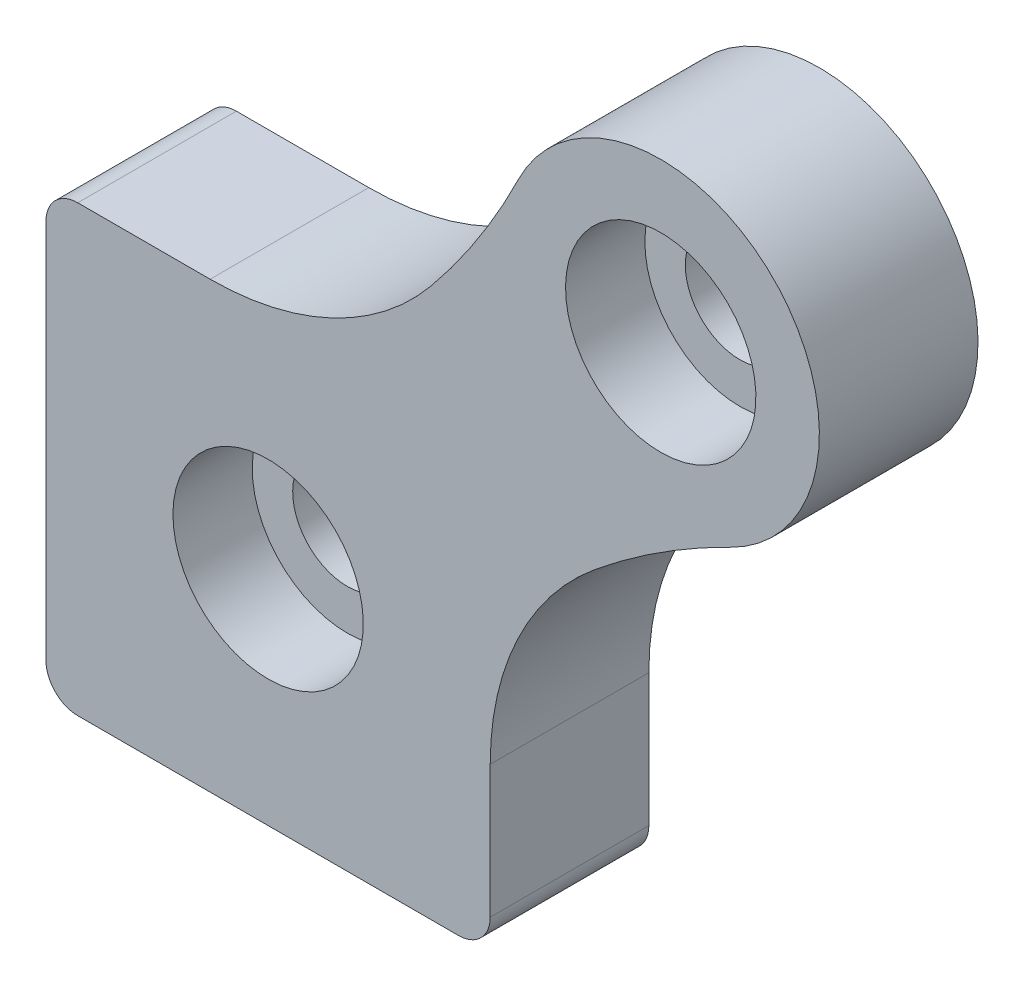
ISO-10303-21;
HEADER;
FILE_DESCRIPTION(('STEP AP214'),'2;1');
FILE_NAME('part.step','',(''),(''),'','','');
FILE_SCHEMA(('AUTOMOTIVE_DESIGN { 1 0 10303 214 1 1 1 1 }'));
ENDSEC;
DATA;
#1=APPLICATION_CONTEXT('core data for automotive mechanical design processes');
#2=APPLICATION_PROTOCOL_DEFINITION('international standard','automotive_design',2000,#1);
#3=PRODUCT_CONTEXT('',#1,'mechanical');
#4=PRODUCT('Part','Part','',(#3));
#5=PRODUCT_RELATED_PRODUCT_CATEGORY('part','',(#4));
#6=PRODUCT_DEFINITION_FORMATION('','',#4);
#7=PRODUCT_DEFINITION_CONTEXT('part definition',#1,'design');
#8=PRODUCT_DEFINITION('design','',#6,#7);
#9=PRODUCT_DEFINITION_SHAPE('','',#8);
#10=(LENGTH_UNIT() NAMED_UNIT(*) SI_UNIT(.MILLI.,.METRE.));
#11=(NAMED_UNIT(*) PLANE_ANGLE_UNIT() SI_UNIT($,.RADIAN.));
#12=(NAMED_UNIT(*) SI_UNIT($,.STERADIAN.) SOLID_ANGLE_UNIT());
#13=UNCERTAINTY_MEASURE_WITH_UNIT(LENGTH_MEASURE(1.E-05),#10,'distance_accuracy_value','');
#14=(GEOMETRIC_REPRESENTATION_CONTEXT(3) GLOBAL_UNCERTAINTY_ASSIGNED_CONTEXT((#13)) GLOBAL_UNIT_ASSIGNED_CONTEXT((#10,
#11,#12)) REPRESENTATION_CONTEXT('',''));
#15=CARTESIAN_POINT('',(0.,0.,0.));
#16=DIRECTION('',(0.,0.,1.));
#17=DIRECTION('',(1.,0.,0.));
#18=AXIS2_PLACEMENT_3D('',#15,#16,#17);
#19=CARTESIAN_POINT('',(-98.3023344038562,333.34350910381,241.099998474121));
#20=DIRECTION('',(0.,0.,1.));
#21=DIRECTION('',(0.707106781186548,0.707106781186547,0.));
#22=AXIS2_PLACEMENT_3D('',#19,#20,#21);
#23=CYLINDRICAL_SURFACE('',#22,1.725);
#24=CARTESIAN_POINT('',(-98.3023344038562,333.34350910381,247.600009918213));
#25=DIRECTION('',(0.,0.,1.));
#26=DIRECTION('',(0.707106781186548,0.707106781186547,0.));
#27=AXIS2_PLACEMENT_3D('',#24,#25,#26);
#28=CIRCLE('',#27,1.725);
#29=CARTESIAN_POINT('',(-97.0825752063094,334.563268301357,247.600009918213));
#30=VERTEX_POINT('',#29);
#31=EDGE_CURVE('E141',#30,#30,#28,.T.);
#32=ORIENTED_EDGE('',*,*,#31,.F.);
#33=EDGE_LOOP('',(#32));
#34=FACE_BOUND('',#33,.T.);
#35=CARTESIAN_POINT('',(-98.3023344038562,333.34350910381,250.100021362305));
#36=DIRECTION('',(0.,0.,1.));
#37=DIRECTION('',(0.707106781186548,0.707106781186547,0.));
#38=AXIS2_PLACEMENT_3D('',#35,#36,#37);
#39=CIRCLE('',#38,1.725);
#40=CARTESIAN_POINT('',(-97.0825752063094,334.563268301357,250.100021362305));
#41=VERTEX_POINT('',#40);
#42=EDGE_CURVE('E10',#41,#41,#39,.T.);
#43=ORIENTED_EDGE('',*,*,#42,.T.);
#44=EDGE_LOOP('',(#43));
#45=FACE_BOUND('',#44,.T.);
#46=ADVANCED_FACE('F15',(#34,#45),#23,.F.);
#47=CARTESIAN_POINT('',(-98.3023344038562,333.34350910381,260.100021362305));
#48=DIRECTION('',(0.,0.,1.));
#49=DIRECTION('',(0.707106781186548,0.707106781186547,0.));
#50=AXIS2_PLACEMENT_3D('',#47,#48,#49);
#51=CYLINDRICAL_SURFACE('',#50,3.);
#52=CARTESIAN_POINT('',(-98.3023344038562,333.34350910381,252.599987030029));
#53=DIRECTION('',(0.,0.,-1.));
#54=DIRECTION('',(0.707106781186548,0.707106781186547,0.));
#55=AXIS2_PLACEMENT_3D('',#52,#53,#54);
#56=CIRCLE('',#55,3.);
#57=CARTESIAN_POINT('',(-96.1810140602965,335.46482944737,252.599987030029));
#58=VERTEX_POINT('',#57);
#59=EDGE_CURVE('E123',#58,#58,#56,.T.);
#60=ORIENTED_EDGE('',*,*,#59,.F.);
#61=EDGE_LOOP('',(#60));
#62=FACE_BOUND('',#61,.T.);
#63=CARTESIAN_POINT('',(-98.3023344038562,333.34350910381,250.100021362305));
#64=DIRECTION('',(0.,0.,-1.));
#65=DIRECTION('',(0.707106781186548,0.707106781186547,0.));
#66=AXIS2_PLACEMENT_3D('',#63,#64,#65);
#67=CIRCLE('',#66,3.);
#68=CARTESIAN_POINT('',(-96.1810140602965,335.46482944737,250.100021362305));
#69=VERTEX_POINT('',#68);
#70=EDGE_CURVE('E25',#69,#69,#67,.T.);
#71=ORIENTED_EDGE('',*,*,#70,.T.);
#72=EDGE_LOOP('',(#71));
#73=FACE_BOUND('',#72,.T.);
#74=ADVANCED_FACE('F276',(#62,#73),#51,.F.);
#75=CARTESIAN_POINT('',(-98.3023344038562,333.34350910381,250.100021362305));
#76=DIRECTION('',(0.,0.,-1.));
#77=DIRECTION('',(-0.707106781186548,-0.707106781186547,0.));
#78=AXIS2_PLACEMENT_3D('',#75,#76,#77);
#79=PLANE('',#78);
#80=ORIENTED_EDGE('',*,*,#42,.F.);
#81=EDGE_LOOP('',(#80));
#82=FACE_BOUND('',#81,.T.);
#83=ORIENTED_EDGE('',*,*,#70,.F.);
#84=EDGE_LOOP('',(#83));
#85=FACE_BOUND('',#84,.T.);
#86=ADVANCED_FACE('F282',(#82,#85),#79,.F.);
#87=CARTESIAN_POINT('',(-110.676703074621,320.969140433045,250.100021362305));
#88=DIRECTION('',(0.,0.,-1.));
#89=DIRECTION('',(-0.707106781186548,-0.707106781186547,0.));
#90=AXIS2_PLACEMENT_3D('',#87,#88,#89);
#91=PLANE('',#90);
#92=CARTESIAN_POINT('',(-110.676703074621,320.969140433045,250.100021362305));
#93=DIRECTION('',(0.,0.,-1.));
#94=DIRECTION('',(0.707106781186548,0.707106781186547,0.));
#95=AXIS2_PLACEMENT_3D('',#92,#93,#94);
#96=CIRCLE('',#95,3.);
#97=CARTESIAN_POINT('',(-108.555382731061,323.090460776605,250.100021362305));
#98=VERTEX_POINT('',#97);
#99=EDGE_CURVE('E138',#98,#98,#96,.T.);
#100=ORIENTED_EDGE('',*,*,#99,.F.);
#101=EDGE_LOOP('',(#100));
#102=FACE_BOUND('',#101,.T.);
#103=CARTESIAN_POINT('',(-110.676703074621,320.969140433045,250.100021362305));
#104=DIRECTION('',(0.,0.,-1.));
#105=DIRECTION('',(0.707106781186548,0.707106781186547,0.));
#106=AXIS2_PLACEMENT_3D('',#103,#104,#105);
#107=CIRCLE('',#106,1.725);
#108=CARTESIAN_POINT('',(-109.456943877074,322.188899630592,250.100021362305));
#109=VERTEX_POINT('',#108);
#110=EDGE_CURVE('E137',#109,#109,#107,.T.);
#111=ORIENTED_EDGE('',*,*,#110,.T.);
#112=EDGE_LOOP('',(#111));
#113=FACE_BOUND('',#112,.T.);
#114=ADVANCED_FACE('F290',(#102,#113),#91,.F.);
#115=CARTESIAN_POINT('',(-110.676703074621,320.969140433045,260.100021362305));
#116=DIRECTION('',(0.,0.,1.));
#117=DIRECTION('',(0.707106781186548,0.707106781186547,0.));
#118=AXIS2_PLACEMENT_3D('',#115,#116,#117);
#119=CYLINDRICAL_SURFACE('',#118,3.);
#120=CARTESIAN_POINT('',(-110.676703074621,320.969140433045,252.599987030029));
#121=DIRECTION('',(0.,0.,-1.));
#122=DIRECTION('',(0.707106781186548,0.707106781186547,0.));
#123=AXIS2_PLACEMENT_3D('',#120,#121,#122);
#124=CIRCLE('',#123,3.);
#125=CARTESIAN_POINT('',(-108.555382731061,323.090460776605,252.599987030029));
#126=VERTEX_POINT('',#125);
#127=EDGE_CURVE('E126',#126,#126,#124,.T.);
#128=ORIENTED_EDGE('',*,*,#127,.F.);
#129=EDGE_LOOP('',(#128));
#130=FACE_BOUND('',#129,.T.);
#131=ORIENTED_EDGE('',*,*,#99,.T.);
#132=EDGE_LOOP('',(#131));
#133=FACE_BOUND('',#132,.T.);
#134=ADVANCED_FACE('F270',(#130,#133),#119,.F.);
#135=CARTESIAN_POINT('',(-110.676703074621,320.969140433045,241.099998474121));
#136=DIRECTION('',(0.,0.,1.));
#137=DIRECTION('',(0.707106781186548,0.707106781186547,0.));
#138=AXIS2_PLACEMENT_3D('',#135,#136,#137);
#139=CYLINDRICAL_SURFACE('',#138,1.725);
#140=CARTESIAN_POINT('',(-110.676703074621,320.969140433045,247.600009918213));
#141=DIRECTION('',(0.,0.,1.));
#142=DIRECTION('',(0.707106781186548,0.707106781186547,0.));
#143=AXIS2_PLACEMENT_3D('',#140,#141,#142);
#144=CIRCLE('',#143,1.725);
#145=CARTESIAN_POINT('',(-109.456943877074,322.188899630592,247.600009918213));
#146=VERTEX_POINT('',#145);
#147=EDGE_CURVE('E144',#146,#146,#144,.T.);
#148=ORIENTED_EDGE('',*,*,#147,.F.);
#149=EDGE_LOOP('',(#148));
#150=FACE_BOUND('',#149,.T.);
#151=ORIENTED_EDGE('',*,*,#110,.F.);
#152=EDGE_LOOP('',(#151));
#153=FACE_BOUND('',#152,.T.);
#154=ADVANCED_FACE('F261',(#150,#153),#139,.F.);
#155=CARTESIAN_POINT('',(-105.340154084218,326.981171906911,247.600009918213));
#156=DIRECTION('',(0.,0.,1.));
#157=DIRECTION('',(0.707106781186548,0.707106781186547,0.));
#158=AXIS2_PLACEMENT_3D('',#155,#156,#157);
#159=PLANE('',#158);
#160=ORIENTED_EDGE('',*,*,#31,.T.);
#161=EDGE_LOOP('',(#160));
#162=FACE_BOUND('',#161,.T.);
#163=ORIENTED_EDGE('',*,*,#147,.T.);
#164=EDGE_LOOP('',(#163));
#165=FACE_BOUND('',#164,.T.);
#166=CARTESIAN_POINT('',(-94.6767030746208,319.14262186003,247.600009918213));
#167=DIRECTION('',(0.,0.,-1.));
#168=DIRECTION('',(-0.904023296282805,0.427483192392369,0.));
#169=AXIS2_PLACEMENT_3D('',#166,#167,#168);
#170=CIRCLE('',#169,9.);
#171=CARTESIAN_POINT('',(-103.676703074621,319.14262186003,247.600009918213));
#172=VERTEX_POINT('',#171);
#173=CARTESIAN_POINT('',(-100.387349238617,326.098807624487,247.600009918213));
#174=VERTEX_POINT('',#173);
#175=EDGE_CURVE('E34',#172,#174,#170,.T.);
#176=ORIENTED_EDGE('',*,*,#175,.F.);
#177=DIRECTION('',(0.,1.,0.));
#178=VECTOR('',#177,1.);
#179=CARTESIAN_POINT('',(-103.676703074621,323.975156169978,247.600009918213));
#180=LINE('',#179,#178);
#181=CARTESIAN_POINT('',(-103.676703074621,314.969140433046,247.600009918213));
#182=VERTEX_POINT('',#181);
#183=EDGE_CURVE('E151',#182,#172,#180,.T.);
#184=ORIENTED_EDGE('',*,*,#183,.F.);
#185=CARTESIAN_POINT('',(-104.676703074621,314.969140433046,247.600009918213));
#186=DIRECTION('',(0.,0.,1.));
#187=DIRECTION('',(0.707106781186547,-0.707106781186548,0.));
#188=AXIS2_PLACEMENT_3D('',#185,#186,#187);
#189=CIRCLE('',#188,1.);
#190=CARTESIAN_POINT('',(-104.676703074621,313.969140433045,247.600009918213));
#191=VERTEX_POINT('',#190);
#192=EDGE_CURVE('E154',#191,#182,#189,.T.);
#193=ORIENTED_EDGE('',*,*,#192,.F.);
#194=DIRECTION('',(1.,0.,0.));
#195=VECTOR('',#194,1.);
#196=CARTESIAN_POINT('',(-108.008428579419,313.969140433046,247.600009918213));
#197=LINE('',#196,#195);
#198=CARTESIAN_POINT('',(-116.676703074621,313.969140433045,247.600009918213));
#199=VERTEX_POINT('',#198);
#200=EDGE_CURVE('E157',#199,#191,#197,.T.);
#201=ORIENTED_EDGE('',*,*,#200,.F.);
#202=CARTESIAN_POINT('',(-116.676703074621,314.969140433046,247.600009918213));
#203=DIRECTION('',(0.,0.,1.));
#204=DIRECTION('',(-0.707106781186548,-0.707106781186547,0.));
#205=AXIS2_PLACEMENT_3D('',#202,#203,#204);
#206=CIRCLE('',#205,1.);
#207=CARTESIAN_POINT('',(-117.676703074621,314.969140433046,247.600009918213));
#208=VERTEX_POINT('',#207);
#209=EDGE_CURVE('E162',#208,#199,#206,.T.);
#210=ORIENTED_EDGE('',*,*,#209,.F.);
#211=DIRECTION('',(0.,-1.,0.));
#212=VECTOR('',#211,1.);
#213=CARTESIAN_POINT('',(-117.676703074621,323.975156169978,247.600009918213));
#214=LINE('',#213,#212);
#215=CARTESIAN_POINT('',(-117.676703074621,326.969140433045,247.600009918213));
#216=VERTEX_POINT('',#215);
#217=EDGE_CURVE('E165',#216,#208,#214,.T.);
#218=ORIENTED_EDGE('',*,*,#217,.F.);
#219=CARTESIAN_POINT('',(-116.676703074621,326.969140433045,247.600009918213));
#220=DIRECTION('',(0.,0.,1.));
#221=DIRECTION('',(-0.707106781186547,0.707106781186548,0.));
#222=AXIS2_PLACEMENT_3D('',#219,#220,#221);
#223=CIRCLE('',#222,1.);
#224=CARTESIAN_POINT('',(-116.676703074621,327.969140433045,247.600009918213));
#225=VERTEX_POINT('',#224);
#226=EDGE_CURVE('E147',#225,#216,#223,.T.);
#227=ORIENTED_EDGE('',*,*,#226,.F.);
#228=DIRECTION('',(-1.,0.,0.));
#229=VECTOR('',#228,1.);
#230=CARTESIAN_POINT('',(-108.008428579419,327.969140433045,247.600009918213));
#231=LINE('',#230,#229);
#232=CARTESIAN_POINT('',(-112.503221647636,327.969140433045,247.600009918213));
#233=VERTEX_POINT('',#232);
#234=EDGE_CURVE('E149',#233,#225,#231,.T.);
#235=ORIENTED_EDGE('',*,*,#234,.F.);
#236=CARTESIAN_POINT('',(-112.503221647636,336.969140433045,247.600009918213));
#237=DIRECTION('',(0.,0.,-1.));
#238=DIRECTION('',(0.427483192392361,-0.904023296282809,0.));
#239=AXIS2_PLACEMENT_3D('',#236,#237,#238);
#240=CIRCLE('',#239,9.);
#241=CARTESIAN_POINT('',(-105.547035883179,331.258494269049,247.600009918213));
#242=VERTEX_POINT('',#241);
#243=EDGE_CURVE('E174',#242,#233,#240,.T.);
#244=ORIENTED_EDGE('',*,*,#243,.F.);
#245=CARTESIAN_POINT('',(-122.551045529629,345.217851558818,247.600009918213));
#246=DIRECTION('',(0.,0.,-1.));
#247=DIRECTION('',(-0.898100412065667,0.439790461296603,0.));
#248=AXIS2_PLACEMENT_3D('',#245,#246,#247);
#249=CIRCLE('',#248,21.9999999999999);
#250=CARTESIAN_POINT('',(-102.792836464185,335.542461410293,247.600009918213));
#251=VERTEX_POINT('',#250);
#252=EDGE_CURVE('E118',#251,#242,#249,.T.);
#253=ORIENTED_EDGE('',*,*,#252,.F.);
#254=CARTESIAN_POINT('',(-98.3023344038563,333.34350910381,247.600009918213));
#255=DIRECTION('',(0.,0.,1.));
#256=DIRECTION('',(0.707106781186548,0.707106781186547,0.));
#257=AXIS2_PLACEMENT_3D('',#254,#255,#256);
#258=CIRCLE('',#257,4.99999999999997);
#259=CARTESIAN_POINT('',(-96.1033820973733,328.853007043482,247.600009918213));
#260=VERTEX_POINT('',#259);
#261=EDGE_CURVE('E111',#260,#251,#258,.T.);
#262=ORIENTED_EDGE('',*,*,#261,.F.);
#263=CARTESIAN_POINT('',(-86.4279919488479,309.094797978037,247.600009918213));
#264=DIRECTION('',(0.,0.,-1.));
#265=DIRECTION('',(0.43979046129661,-0.898100412065664,0.));
#266=AXIS2_PLACEMENT_3D('',#263,#264,#265);
#267=CIRCLE('',#266,22.);
#268=EDGE_CURVE('E179',#174,#260,#267,.T.);
#269=ORIENTED_EDGE('',*,*,#268,.F.);
#270=EDGE_LOOP('',(#176,#184,#193,#201,#210,#218,#227,#235,#244,#253,#262,#269));
#271=FACE_BOUND('',#270,.T.);
#272=ADVANCED_FACE('F259',(#162,#165,#271),#159,.F.);
#273=CARTESIAN_POINT('',(-116.676703074621,326.969140433045,259.100028991699));
#274=DIRECTION('',(0.,0.,-1.));
#275=DIRECTION('',(-0.707106781186547,0.707106781186548,0.));
#276=AXIS2_PLACEMENT_3D('',#273,#274,#275);
#277=CYLINDRICAL_SURFACE('',#276,1.);
#278=ORIENTED_EDGE('',*,*,#226,.T.);
#279=DIRECTION('',(0.,0.,1.));
#280=VECTOR('',#279,1.);
#281=CARTESIAN_POINT('',(-117.676703074621,326.969140433045,259.100028991699));
#282=LINE('',#281,#280);
#283=CARTESIAN_POINT('',(-117.676703074621,326.969140433045,252.599990844727));
#284=VERTEX_POINT('',#283);
#285=EDGE_CURVE('E172',#216,#284,#282,.T.);
#286=ORIENTED_EDGE('',*,*,#285,.T.);
#287=CARTESIAN_POINT('',(-116.676703074621,326.969140433045,252.599987030029));
#288=DIRECTION('',(0.,0.,-1.));
#289=DIRECTION('',(-0.707106781186547,0.707106781186548,0.));
#290=AXIS2_PLACEMENT_3D('',#287,#288,#289);
#291=CIRCLE('',#290,1.);
#292=CARTESIAN_POINT('',(-116.676703074621,327.969140433045,252.599990844727));
#293=VERTEX_POINT('',#292);
#294=EDGE_CURVE('E185',#284,#293,#291,.T.);
#295=ORIENTED_EDGE('',*,*,#294,.T.);
#296=DIRECTION('',(0.,0.,-1.));
#297=VECTOR('',#296,1.);
#298=CARTESIAN_POINT('',(-116.676703074621,327.969140433045,259.100028991699));
#299=LINE('',#298,#297);
#300=EDGE_CURVE('E169',#293,#225,#299,.T.);
#301=ORIENTED_EDGE('',*,*,#300,.T.);
#302=EDGE_LOOP('',(#278,#286,#295,#301));
#303=FACE_BOUND('',#302,.T.);
#304=ADVANCED_FACE('F234',(#303),#277,.T.);
#305=CARTESIAN_POINT('',(-117.676703074621,320.969140433045,259.100028991699));
#306=DIRECTION('',(1.,0.,0.));
#307=DIRECTION('',(0.,0.,-1.));
#308=AXIS2_PLACEMENT_3D('',#305,#306,#307);
#309=PLANE('',#308);
#310=ORIENTED_EDGE('',*,*,#217,.T.);
#311=DIRECTION('',(0.,0.,-1.));
#312=VECTOR('',#311,1.);
#313=CARTESIAN_POINT('',(-117.676703074621,314.969140433046,259.100028991699));
#314=LINE('',#313,#312);
#315=CARTESIAN_POINT('',(-117.676703074621,314.969140433046,252.599990844727));
#316=VERTEX_POINT('',#315);
#317=EDGE_CURVE('E161',#316,#208,#314,.T.);
#318=ORIENTED_EDGE('',*,*,#317,.F.);
#319=DIRECTION('',(0.,-1.,0.));
#320=VECTOR('',#319,1.);
#321=CARTESIAN_POINT('',(-117.676703074621,320.969140433045,252.599990844727));
#322=LINE('',#321,#320);
#323=EDGE_CURVE('E193',#284,#316,#322,.T.);
#324=ORIENTED_EDGE('',*,*,#323,.F.);
#325=ORIENTED_EDGE('',*,*,#285,.F.);
#326=EDGE_LOOP('',(#310,#318,#324,#325));
#327=FACE_BOUND('',#326,.T.);
#328=ADVANCED_FACE('F239',(#327),#309,.F.);
#329=CARTESIAN_POINT('',(-116.676703074621,314.969140433046,259.100028991699));
#330=DIRECTION('',(0.,0.,-1.));
#331=DIRECTION('',(-0.707106781186548,-0.707106781186547,0.));
#332=AXIS2_PLACEMENT_3D('',#329,#330,#331);
#333=CYLINDRICAL_SURFACE('',#332,1.);
#334=ORIENTED_EDGE('',*,*,#209,.T.);
#335=DIRECTION('',(0.,0.,1.));
#336=VECTOR('',#335,1.);
#337=CARTESIAN_POINT('',(-116.676703074621,313.969140433045,259.100028991699));
#338=LINE('',#337,#336);
#339=CARTESIAN_POINT('',(-116.676703074621,313.969140433045,252.599990844727));
#340=VERTEX_POINT('',#339);
#341=EDGE_CURVE('E166',#199,#340,#338,.T.);
#342=ORIENTED_EDGE('',*,*,#341,.T.);
#343=CARTESIAN_POINT('',(-116.676703074621,314.969140433046,252.599987030029));
#344=DIRECTION('',(0.,0.,-1.));
#345=DIRECTION('',(-0.707106781186548,-0.707106781186547,0.));
#346=AXIS2_PLACEMENT_3D('',#343,#344,#345);
#347=CIRCLE('',#346,1.);
#348=EDGE_CURVE('E192',#340,#316,#347,.T.);
#349=ORIENTED_EDGE('',*,*,#348,.T.);
#350=ORIENTED_EDGE('',*,*,#317,.T.);
#351=EDGE_LOOP('',(#334,#342,#349,#350));
#352=FACE_BOUND('',#351,.T.);
#353=ADVANCED_FACE('F244',(#352),#333,.T.);
#354=CARTESIAN_POINT('',(-110.676703074621,313.969140433045,259.100028991699));
#355=DIRECTION('',(0.,1.,0.));
#356=DIRECTION('',(0.,0.,1.));
#357=AXIS2_PLACEMENT_3D('',#354,#355,#356);
#358=PLANE('',#357);
#359=ORIENTED_EDGE('',*,*,#200,.T.);
#360=DIRECTION('',(0.,0.,-1.));
#361=VECTOR('',#360,1.);
#362=CARTESIAN_POINT('',(-104.676703074621,313.969140433045,259.100028991699));
#363=LINE('',#362,#361);
#364=CARTESIAN_POINT('',(-104.676703074621,313.969140433045,252.599990844727));
#365=VERTEX_POINT('',#364);
#366=EDGE_CURVE('E153',#365,#191,#363,.T.);
#367=ORIENTED_EDGE('',*,*,#366,.F.);
#368=DIRECTION('',(1.,0.,0.));
#369=VECTOR('',#368,1.);
#370=CARTESIAN_POINT('',(-110.676703074621,313.969140433045,252.599990844727));
#371=LINE('',#370,#369);
#372=EDGE_CURVE('E196',#340,#365,#371,.T.);
#373=ORIENTED_EDGE('',*,*,#372,.F.);
#374=ORIENTED_EDGE('',*,*,#341,.F.);
#375=EDGE_LOOP('',(#359,#367,#373,#374));
#376=FACE_BOUND('',#375,.T.);
#377=ADVANCED_FACE('F246',(#376),#358,.F.);
#378=CARTESIAN_POINT('',(-104.676703074621,314.969140433046,259.100028991699));
#379=DIRECTION('',(0.,0.,-1.));
#380=DIRECTION('',(0.707106781186547,-0.707106781186548,0.));
#381=AXIS2_PLACEMENT_3D('',#378,#379,#380);
#382=CYLINDRICAL_SURFACE('',#381,1.);
#383=ORIENTED_EDGE('',*,*,#192,.T.);
#384=DIRECTION('',(0.,0.,1.));
#385=VECTOR('',#384,1.);
#386=CARTESIAN_POINT('',(-103.676703074621,314.969140433046,259.100028991699));
#387=LINE('',#386,#385);
#388=CARTESIAN_POINT('',(-103.676703074621,314.969140433046,252.599990844727));
#389=VERTEX_POINT('',#388);
#390=EDGE_CURVE('E158',#182,#389,#387,.T.);
#391=ORIENTED_EDGE('',*,*,#390,.T.);
#392=CARTESIAN_POINT('',(-104.676703074621,314.969140433046,252.599987030029));
#393=DIRECTION('',(0.,0.,-1.));
#394=DIRECTION('',(0.707106781186547,-0.707106781186548,0.));
#395=AXIS2_PLACEMENT_3D('',#392,#393,#394);
#396=CIRCLE('',#395,1.);
#397=EDGE_CURVE('E203',#389,#365,#396,.T.);
#398=ORIENTED_EDGE('',*,*,#397,.T.);
#399=ORIENTED_EDGE('',*,*,#366,.T.);
#400=EDGE_LOOP('',(#383,#391,#398,#399));
#401=FACE_BOUND('',#400,.T.);
#402=ADVANCED_FACE('F248',(#401),#382,.T.);
#403=CARTESIAN_POINT('',(-103.676703074621,320.969140433046,259.100028991699));
#404=DIRECTION('',(-1.,0.,0.));
#405=DIRECTION('',(0.,0.,1.));
#406=AXIS2_PLACEMENT_3D('',#403,#404,#405);
#407=PLANE('',#406);
#408=ORIENTED_EDGE('',*,*,#183,.T.);
#409=DIRECTION('',(0.,0.,-1.));
#410=VECTOR('',#409,1.);
#411=CARTESIAN_POINT('',(-103.676703074621,319.14262186003,241.599998474121));
#412=LINE('',#411,#410);
#413=CARTESIAN_POINT('',(-103.676703074621,319.14262186003,252.599990844727));
#414=VERTEX_POINT('',#413);
#415=EDGE_CURVE('E182',#414,#172,#412,.T.);
#416=ORIENTED_EDGE('',*,*,#415,.F.);
#417=DIRECTION('',(0.,1.,0.));
#418=VECTOR('',#417,1.);
#419=CARTESIAN_POINT('',(-103.676703074621,320.969140433046,252.599990844727));
#420=LINE('',#419,#418);
#421=EDGE_CURVE('E131',#389,#414,#420,.T.);
#422=ORIENTED_EDGE('',*,*,#421,.F.);
#423=ORIENTED_EDGE('',*,*,#390,.F.);
#424=EDGE_LOOP('',(#408,#416,#422,#423));
#425=FACE_BOUND('',#424,.T.);
#426=ADVANCED_FACE('F253',(#425),#407,.F.);
#427=CARTESIAN_POINT('',(-110.676703074621,327.969140433045,259.100028991699));
#428=DIRECTION('',(0.,-1.,0.));
#429=DIRECTION('',(0.,0.,-1.));
#430=AXIS2_PLACEMENT_3D('',#427,#428,#429);
#431=PLANE('',#430);
#432=ORIENTED_EDGE('',*,*,#234,.T.);
#433=ORIENTED_EDGE('',*,*,#300,.F.);
#434=DIRECTION('',(-1.,0.,0.));
#435=VECTOR('',#434,1.);
#436=CARTESIAN_POINT('',(-110.676703074621,327.969140433045,252.599990844727));
#437=LINE('',#436,#435);
#438=CARTESIAN_POINT('',(-112.503221647636,327.969140433045,252.599990844727));
#439=VERTEX_POINT('',#438);
#440=EDGE_CURVE('E195',#439,#293,#437,.T.);
#441=ORIENTED_EDGE('',*,*,#440,.F.);
#442=DIRECTION('',(0.,0.,1.));
#443=VECTOR('',#442,1.);
#444=CARTESIAN_POINT('',(-112.503221647636,327.969140433045,241.599998474121));
#445=LINE('',#444,#443);
#446=EDGE_CURVE('E177',#233,#439,#445,.T.);
#447=ORIENTED_EDGE('',*,*,#446,.F.);
#448=EDGE_LOOP('',(#432,#433,#441,#447));
#449=FACE_BOUND('',#448,.T.);
#450=ADVANCED_FACE('F231',(#449),#431,.F.);
#451=CARTESIAN_POINT('',(-94.6767030746208,319.14262186003,241.599998474121));
#452=DIRECTION('',(0.,0.,-1.));
#453=DIRECTION('',(-0.904023296282805,0.427483192392369,0.));
#454=AXIS2_PLACEMENT_3D('',#451,#452,#453);
#455=CYLINDRICAL_SURFACE('',#454,9.);
#456=ORIENTED_EDGE('',*,*,#175,.T.);
#457=DIRECTION('',(0.,0.,1.));
#458=VECTOR('',#457,1.);
#459=CARTESIAN_POINT('',(-100.387349238617,326.098807624487,241.599998474121));
#460=LINE('',#459,#458);
#461=CARTESIAN_POINT('',(-100.387349238617,326.098807624487,252.599987030029));
#462=VERTEX_POINT('',#461);
#463=EDGE_CURVE('E150',#174,#462,#460,.T.);
#464=ORIENTED_EDGE('',*,*,#463,.T.);
#465=CARTESIAN_POINT('',(-94.6767030746208,319.14262186003,252.599987030029));
#466=DIRECTION('',(0.,0.,1.));
#467=DIRECTION('',(-0.904023296282805,0.427483192392369,0.));
#468=AXIS2_PLACEMENT_3D('',#465,#466,#467);
#469=CIRCLE('',#468,9.);
#470=EDGE_CURVE('E211',#462,#414,#469,.T.);
#471=ORIENTED_EDGE('',*,*,#470,.T.);
#472=ORIENTED_EDGE('',*,*,#415,.T.);
#473=EDGE_LOOP('',(#456,#464,#471,#472));
#474=FACE_BOUND('',#473,.T.);
#475=ADVANCED_FACE('F255',(#474),#455,.F.);
#476=CARTESIAN_POINT('',(-86.4279919488479,309.094797978037,241.599998474121));
#477=DIRECTION('',(0.,0.,1.));
#478=DIRECTION('',(0.43979046129661,-0.898100412065664,0.));
#479=AXIS2_PLACEMENT_3D('',#476,#477,#478);
#480=CYLINDRICAL_SURFACE('',#479,22.);
#481=ORIENTED_EDGE('',*,*,#268,.T.);
#482=DIRECTION('',(0.,0.,1.));
#483=VECTOR('',#482,1.);
#484=CARTESIAN_POINT('',(-96.1033820973733,328.853007043482,241.599998474121));
#485=LINE('',#484,#483);
#486=CARTESIAN_POINT('',(-96.1033820973733,328.853007043482,252.599987030029));
#487=VERTEX_POINT('',#486);
#488=EDGE_CURVE('E176',#260,#487,#485,.T.);
#489=ORIENTED_EDGE('',*,*,#488,.T.);
#490=CARTESIAN_POINT('',(-86.4279919488479,309.094797978037,252.599987030029));
#491=DIRECTION('',(0.,0.,-1.));
#492=DIRECTION('',(0.43979046129661,-0.898100412065664,0.));
#493=AXIS2_PLACEMENT_3D('',#490,#491,#492);
#494=CIRCLE('',#493,22.);
#495=EDGE_CURVE('E121',#462,#487,#494,.T.);
#496=ORIENTED_EDGE('',*,*,#495,.F.);
#497=ORIENTED_EDGE('',*,*,#463,.F.);
#498=EDGE_LOOP('',(#481,#489,#496,#497));
#499=FACE_BOUND('',#498,.T.);
#500=ADVANCED_FACE('F258',(#499),#480,.F.);
#501=CARTESIAN_POINT('',(-112.503221647636,336.969140433045,241.599998474121));
#502=DIRECTION('',(0.,0.,1.));
#503=DIRECTION('',(0.427483192392361,-0.904023296282809,0.));
#504=AXIS2_PLACEMENT_3D('',#501,#502,#503);
#505=CYLINDRICAL_SURFACE('',#504,9.);
#506=ORIENTED_EDGE('',*,*,#243,.T.);
#507=ORIENTED_EDGE('',*,*,#446,.T.);
#508=CARTESIAN_POINT('',(-112.503221647636,336.969140433045,252.599987030029));
#509=DIRECTION('',(0.,0.,1.));
#510=DIRECTION('',(0.427483192392361,-0.904023296282809,0.));
#511=AXIS2_PLACEMENT_3D('',#508,#509,#510);
#512=CIRCLE('',#511,9.);
#513=CARTESIAN_POINT('',(-105.547035883179,331.258494269049,252.599987030029));
#514=VERTEX_POINT('',#513);
#515=EDGE_CURVE('E217',#439,#514,#512,.T.);
#516=ORIENTED_EDGE('',*,*,#515,.T.);
#517=DIRECTION('',(0.,0.,-1.));
#518=VECTOR('',#517,1.);
#519=CARTESIAN_POINT('',(-105.547035883179,331.258494269049,241.599998474121));
#520=LINE('',#519,#518);
#521=EDGE_CURVE('E101',#514,#242,#520,.T.);
#522=ORIENTED_EDGE('',*,*,#521,.T.);
#523=EDGE_LOOP('',(#506,#507,#516,#522));
#524=FACE_BOUND('',#523,.T.);
#525=ADVANCED_FACE('F226',(#524),#505,.F.);
#526=CARTESIAN_POINT('',(-122.551045529629,345.217851558818,241.599998474121));
#527=DIRECTION('',(0.,0.,-1.));
#528=DIRECTION('',(-0.898100412065667,0.439790461296603,0.));
#529=AXIS2_PLACEMENT_3D('',#526,#527,#528);
#530=CYLINDRICAL_SURFACE('',#529,21.9999999999999);
#531=ORIENTED_EDGE('',*,*,#252,.T.);
#532=ORIENTED_EDGE('',*,*,#521,.F.);
#533=CARTESIAN_POINT('',(-122.551045529629,345.217851558818,252.599987030029));
#534=DIRECTION('',(0.,0.,1.));
#535=DIRECTION('',(-0.898100412065667,0.439790461296603,0.));
#536=AXIS2_PLACEMENT_3D('',#533,#534,#535);
#537=CIRCLE('',#536,21.9999999999999);
#538=CARTESIAN_POINT('',(-102.792836464185,335.542461410293,252.599987030029));
#539=VERTEX_POINT('',#538);
#540=EDGE_CURVE('E113',#514,#539,#537,.T.);
#541=ORIENTED_EDGE('',*,*,#540,.T.);
#542=DIRECTION('',(0.,0.,-1.));
#543=VECTOR('',#542,1.);
#544=CARTESIAN_POINT('',(-102.792836464185,335.542461410293,241.599998474121));
#545=LINE('',#544,#543);
#546=EDGE_CURVE('E107',#539,#251,#545,.T.);
#547=ORIENTED_EDGE('',*,*,#546,.T.);
#548=EDGE_LOOP('',(#531,#532,#541,#547));
#549=FACE_BOUND('',#548,.T.);
#550=ADVANCED_FACE('F115',(#549),#530,.F.);
#551=CARTESIAN_POINT('',(-98.3023344038563,333.34350910381,241.599998474121));
#552=DIRECTION('',(0.,0.,-1.));
#553=DIRECTION('',(0.707106781186548,0.707106781186547,0.));
#554=AXIS2_PLACEMENT_3D('',#551,#552,#553);
#555=CYLINDRICAL_SURFACE('',#554,4.99999999999997);
#556=ORIENTED_EDGE('',*,*,#261,.T.);
#557=ORIENTED_EDGE('',*,*,#546,.F.);
#558=CARTESIAN_POINT('',(-98.3023344038563,333.34350910381,252.599987030029));
#559=DIRECTION('',(0.,0.,-1.));
#560=DIRECTION('',(0.707106781186548,0.707106781186547,0.));
#561=AXIS2_PLACEMENT_3D('',#558,#559,#560);
#562=CIRCLE('',#561,4.99999999999997);
#563=EDGE_CURVE('E19',#539,#487,#562,.T.);
#564=ORIENTED_EDGE('',*,*,#563,.T.);
#565=ORIENTED_EDGE('',*,*,#488,.F.);
#566=EDGE_LOOP('',(#556,#557,#564,#565));
#567=FACE_BOUND('',#566,.T.);
#568=ADVANCED_FACE('F108',(#567),#555,.T.);
#569=CARTESIAN_POINT('',(-104.270419864541,328.105986999969,252.599987030029));
#570=DIRECTION('',(0.,0.,1.));
#571=DIRECTION('',(0.707106781186548,0.707106781186547,0.));
#572=AXIS2_PLACEMENT_3D('',#569,#570,#571);
#573=PLANE('',#572);
#574=ORIENTED_EDGE('',*,*,#59,.T.);
#575=EDGE_LOOP('',(#574));
#576=FACE_BOUND('',#575,.T.);
#577=ORIENTED_EDGE('',*,*,#127,.T.);
#578=EDGE_LOOP('',(#577));
#579=FACE_BOUND('',#578,.T.);
#580=ORIENTED_EDGE('',*,*,#397,.F.);
#581=ORIENTED_EDGE('',*,*,#421,.T.);
#582=ORIENTED_EDGE('',*,*,#470,.F.);
#583=ORIENTED_EDGE('',*,*,#495,.T.);
#584=ORIENTED_EDGE('',*,*,#563,.F.);
#585=ORIENTED_EDGE('',*,*,#540,.F.);
#586=ORIENTED_EDGE('',*,*,#515,.F.);
#587=ORIENTED_EDGE('',*,*,#440,.T.);
#588=ORIENTED_EDGE('',*,*,#294,.F.);
#589=ORIENTED_EDGE('',*,*,#323,.T.);
#590=ORIENTED_EDGE('',*,*,#348,.F.);
#591=ORIENTED_EDGE('',*,*,#372,.T.);
#592=EDGE_LOOP('',(#580,#581,#582,#583,#584,#585,#586,#587,#588,#589,#590,#591));
#593=FACE_BOUND('',#592,.T.);
#594=ADVANCED_FACE('F17',(#576,#579,#593),#573,.T.);
#595=CLOSED_SHELL('',(#46,#74,#86,#114,#134,#154,#272,#304,#328,#353,#377,#402,#426,#450,#475,
#500,#525,#550,#568,#594));
#596=MANIFOLD_SOLID_BREP('B1',#595);
#597=ADVANCED_BREP_SHAPE_REPRESENTATION('',(#18,#596),#14);
#598=SHAPE_DEFINITION_REPRESENTATION(#9,#597);
ENDSEC;
END-ISO-10303-21;
